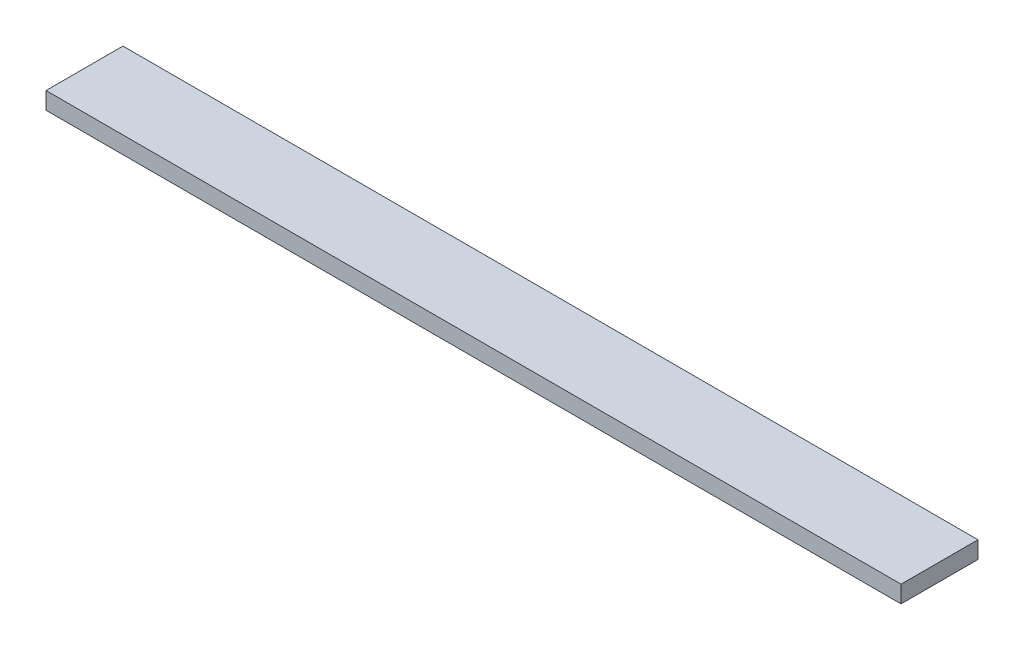
ISO-10303-21;
HEADER;
FILE_DESCRIPTION(('STEP AP214'),'2;1');
FILE_NAME('part.step','',(''),(''),'','','');
FILE_SCHEMA(('AUTOMOTIVE_DESIGN { 1 0 10303 214 1 1 1 1 }'));
ENDSEC;
DATA;
#1=APPLICATION_CONTEXT('core data for automotive mechanical design processes');
#2=APPLICATION_PROTOCOL_DEFINITION('international standard','automotive_design',2000,#1);
#3=PRODUCT_CONTEXT('',#1,'mechanical');
#4=PRODUCT('Part','Part','',(#3));
#5=PRODUCT_RELATED_PRODUCT_CATEGORY('part','',(#4));
#6=PRODUCT_DEFINITION_FORMATION('','',#4);
#7=PRODUCT_DEFINITION_CONTEXT('part definition',#1,'design');
#8=PRODUCT_DEFINITION('design','',#6,#7);
#9=PRODUCT_DEFINITION_SHAPE('','',#8);
#10=(LENGTH_UNIT() NAMED_UNIT(*) SI_UNIT(.MILLI.,.METRE.));
#11=(NAMED_UNIT(*) PLANE_ANGLE_UNIT() SI_UNIT($,.RADIAN.));
#12=(NAMED_UNIT(*) SI_UNIT($,.STERADIAN.) SOLID_ANGLE_UNIT());
#13=UNCERTAINTY_MEASURE_WITH_UNIT(LENGTH_MEASURE(1.E-05),#10,'distance_accuracy_value','');
#14=(GEOMETRIC_REPRESENTATION_CONTEXT(3) GLOBAL_UNCERTAINTY_ASSIGNED_CONTEXT((#13)) GLOBAL_UNIT_ASSIGNED_CONTEXT((#10,
#11,#12)) REPRESENTATION_CONTEXT('',''));
#15=CARTESIAN_POINT('',(0.,0.,0.));
#16=DIRECTION('',(0.,0.,1.));
#17=DIRECTION('',(1.,0.,0.));
#18=AXIS2_PLACEMENT_3D('',#15,#16,#17);
#19=CARTESIAN_POINT('',(500.,0.,0.));
#20=DIRECTION('',(0.,0.,-1.));
#21=DIRECTION('',(-1.,0.,0.));
#22=AXIS2_PLACEMENT_3D('',#19,#20,#21);
#23=PLANE('',#22);
#24=DIRECTION('',(0.,-1.,0.));
#25=VECTOR('',#24,1.);
#26=CARTESIAN_POINT('',(0.,0.,0.));
#27=LINE('',#26,#25);
#28=CARTESIAN_POINT('',(0.,10.,0.));
#29=VERTEX_POINT('',#28);
#30=CARTESIAN_POINT('',(0.,0.,0.));
#31=VERTEX_POINT('',#30);
#32=EDGE_CURVE('E95',#29,#31,#27,.T.);
#33=ORIENTED_EDGE('',*,*,#32,.T.);
#34=DIRECTION('',(-1.,0.,0.));
#35=VECTOR('',#34,1.);
#36=CARTESIAN_POINT('',(500.,0.,0.));
#37=LINE('',#36,#35);
#38=CARTESIAN_POINT('',(500.,0.,0.));
#39=VERTEX_POINT('',#38);
#40=EDGE_CURVE('E11',#39,#31,#37,.T.);
#41=ORIENTED_EDGE('',*,*,#40,.F.);
#42=DIRECTION('',(0.,-1.,0.));
#43=VECTOR('',#42,1.);
#44=CARTESIAN_POINT('',(500.,0.,0.));
#45=LINE('',#44,#43);
#46=CARTESIAN_POINT('',(500.,10.,0.));
#47=VERTEX_POINT('',#46);
#48=EDGE_CURVE('E83',#47,#39,#45,.T.);
#49=ORIENTED_EDGE('',*,*,#48,.F.);
#50=DIRECTION('',(-1.,0.,0.));
#51=VECTOR('',#50,1.);
#52=CARTESIAN_POINT('',(500.,10.,0.));
#53=LINE('',#52,#51);
#54=EDGE_CURVE('E91',#47,#29,#53,.T.);
#55=ORIENTED_EDGE('',*,*,#54,.T.);
#56=EDGE_LOOP('',(#33,#41,#49,#55));
#57=FACE_BOUND('',#56,.T.);
#58=ADVANCED_FACE('F32',(#57),#23,.F.);
#59=CARTESIAN_POINT('',(500.,0.,0.));
#60=DIRECTION('',(0.,1.,0.));
#61=DIRECTION('',(0.,0.,1.));
#62=AXIS2_PLACEMENT_3D('',#59,#60,#61);
#63=PLANE('',#62);
#64=DIRECTION('',(0.,0.,-1.));
#65=VECTOR('',#64,1.);
#66=CARTESIAN_POINT('',(0.,0.,0.));
#67=LINE('',#66,#65);
#68=CARTESIAN_POINT('',(0.,0.,-45.));
#69=VERTEX_POINT('',#68);
#70=EDGE_CURVE('E87',#31,#69,#67,.T.);
#71=ORIENTED_EDGE('',*,*,#70,.T.);
#72=DIRECTION('',(-1.,0.,0.));
#73=VECTOR('',#72,1.);
#74=CARTESIAN_POINT('',(500.,0.,-45.));
#75=LINE('',#74,#73);
#76=CARTESIAN_POINT('',(500.,0.,-45.));
#77=VERTEX_POINT('',#76);
#78=EDGE_CURVE('E40',#77,#69,#75,.T.);
#79=ORIENTED_EDGE('',*,*,#78,.F.);
#80=DIRECTION('',(0.,0.,-1.));
#81=VECTOR('',#80,1.);
#82=CARTESIAN_POINT('',(500.,0.,0.));
#83=LINE('',#82,#81);
#84=EDGE_CURVE('E78',#39,#77,#83,.T.);
#85=ORIENTED_EDGE('',*,*,#84,.F.);
#86=ORIENTED_EDGE('',*,*,#40,.T.);
#87=EDGE_LOOP('',(#71,#79,#85,#86));
#88=FACE_BOUND('',#87,.T.);
#89=ADVANCED_FACE('F86',(#88),#63,.F.);
#90=CARTESIAN_POINT('',(500.,0.,-45.));
#91=DIRECTION('',(0.,0.,1.));
#92=DIRECTION('',(1.,0.,0.));
#93=AXIS2_PLACEMENT_3D('',#90,#91,#92);
#94=PLANE('',#93);
#95=DIRECTION('',(0.,1.,0.));
#96=VECTOR('',#95,1.);
#97=CARTESIAN_POINT('',(0.,0.,-45.));
#98=LINE('',#97,#96);
#99=CARTESIAN_POINT('',(0.,10.,-45.));
#100=VERTEX_POINT('',#99);
#101=EDGE_CURVE('E65',#69,#100,#98,.T.);
#102=ORIENTED_EDGE('',*,*,#101,.T.);
#103=DIRECTION('',(-1.,0.,0.));
#104=VECTOR('',#103,1.);
#105=CARTESIAN_POINT('',(500.,10.,-45.));
#106=LINE('',#105,#104);
#107=CARTESIAN_POINT('',(500.,10.,-45.));
#108=VERTEX_POINT('',#107);
#109=EDGE_CURVE('E88',#108,#100,#106,.T.);
#110=ORIENTED_EDGE('',*,*,#109,.F.);
#111=DIRECTION('',(0.,1.,0.));
#112=VECTOR('',#111,1.);
#113=CARTESIAN_POINT('',(500.,0.,-45.));
#114=LINE('',#113,#112);
#115=EDGE_CURVE('E81',#77,#108,#114,.T.);
#116=ORIENTED_EDGE('',*,*,#115,.F.);
#117=ORIENTED_EDGE('',*,*,#78,.T.);
#118=EDGE_LOOP('',(#102,#110,#116,#117));
#119=FACE_BOUND('',#118,.T.);
#120=ADVANCED_FACE('F89',(#119),#94,.F.);
#121=CARTESIAN_POINT('',(500.,10.,0.));
#122=DIRECTION('',(0.,-1.,0.));
#123=DIRECTION('',(0.,0.,-1.));
#124=AXIS2_PLACEMENT_3D('',#121,#122,#123);
#125=PLANE('',#124);
#126=DIRECTION('',(0.,0.,1.));
#127=VECTOR('',#126,1.);
#128=CARTESIAN_POINT('',(0.,10.,0.));
#129=LINE('',#128,#127);
#130=EDGE_CURVE('E71',#100,#29,#129,.T.);
#131=ORIENTED_EDGE('',*,*,#130,.T.);
#132=ORIENTED_EDGE('',*,*,#54,.F.);
#133=DIRECTION('',(0.,0.,1.));
#134=VECTOR('',#133,1.);
#135=CARTESIAN_POINT('',(500.,10.,0.));
#136=LINE('',#135,#134);
#137=EDGE_CURVE('E48',#108,#47,#136,.T.);
#138=ORIENTED_EDGE('',*,*,#137,.F.);
#139=ORIENTED_EDGE('',*,*,#109,.T.);
#140=EDGE_LOOP('',(#131,#132,#138,#139));
#141=FACE_BOUND('',#140,.T.);
#142=ADVANCED_FACE('F102',(#141),#125,.F.);
#143=CARTESIAN_POINT('',(500.,0.,0.));
#144=DIRECTION('',(-1.,0.,0.));
#145=DIRECTION('',(0.,0.,1.));
#146=AXIS2_PLACEMENT_3D('',#143,#144,#145);
#147=PLANE('',#146);
#148=ORIENTED_EDGE('',*,*,#48,.T.);
#149=ORIENTED_EDGE('',*,*,#84,.T.);
#150=ORIENTED_EDGE('',*,*,#115,.T.);
#151=ORIENTED_EDGE('',*,*,#137,.T.);
#152=EDGE_LOOP('',(#148,#149,#150,#151));
#153=FACE_BOUND('',#152,.T.);
#154=ADVANCED_FACE('F79',(#153),#147,.F.);
#155=CARTESIAN_POINT('',(0.,0.,0.));
#156=DIRECTION('',(-1.,0.,0.));
#157=DIRECTION('',(0.,0.,1.));
#158=AXIS2_PLACEMENT_3D('',#155,#156,#157);
#159=PLANE('',#158);
#160=ORIENTED_EDGE('',*,*,#32,.F.);
#161=ORIENTED_EDGE('',*,*,#130,.F.);
#162=ORIENTED_EDGE('',*,*,#101,.F.);
#163=ORIENTED_EDGE('',*,*,#70,.F.);
#164=EDGE_LOOP('',(#160,#161,#162,#163));
#165=FACE_BOUND('',#164,.T.);
#166=ADVANCED_FACE('F105',(#165),#159,.T.);
#167=CLOSED_SHELL('',(#58,#89,#120,#142,#154,#166));
#168=MANIFOLD_SOLID_BREP('B2',#167);
#169=ADVANCED_BREP_SHAPE_REPRESENTATION('',(#18,#168),#14);
#170=SHAPE_DEFINITION_REPRESENTATION(#9,#169);
ENDSEC;
END-ISO-10303-21;
